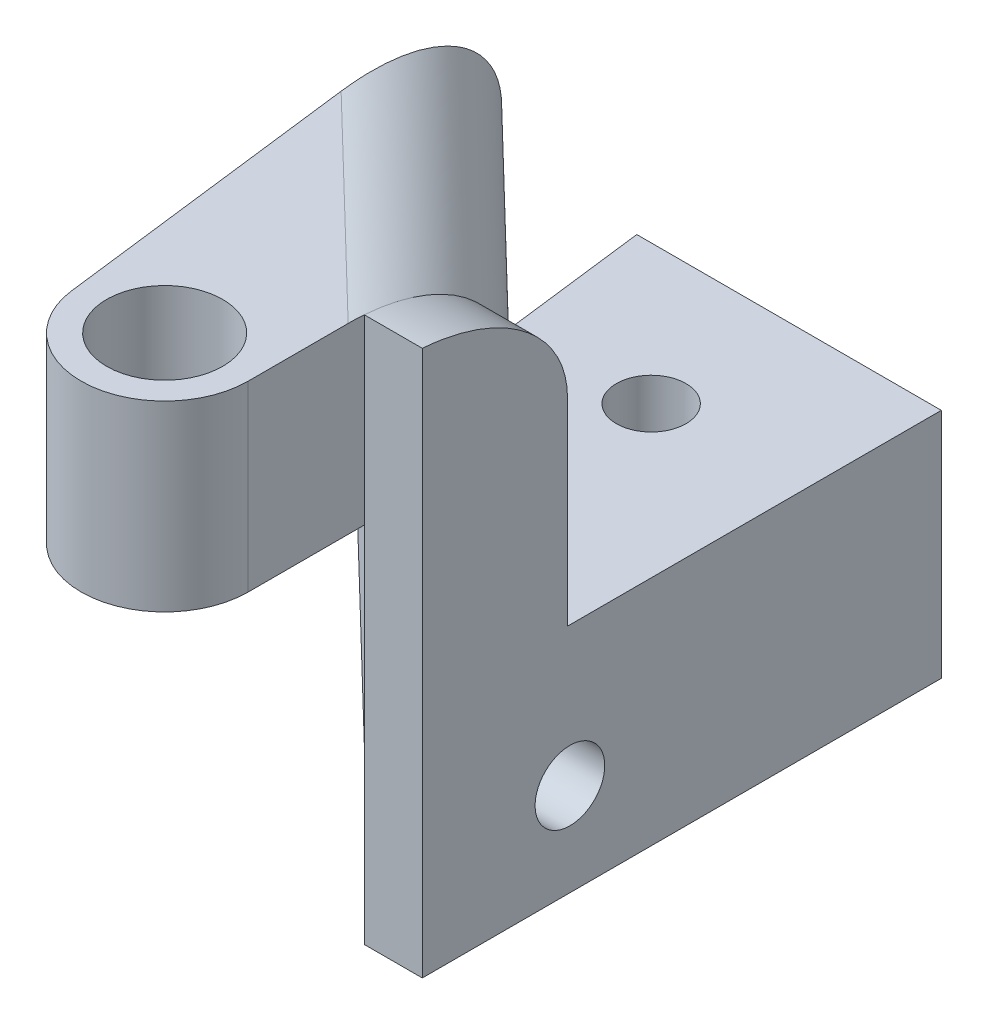
ISO-10303-21;
HEADER;
FILE_DESCRIPTION(('STEP AP214'),'2;1');
FILE_NAME('part.step','',(''),(''),'','','');
FILE_SCHEMA(('AUTOMOTIVE_DESIGN { 1 0 10303 214 1 1 1 1 }'));
ENDSEC;
DATA;
#1=APPLICATION_CONTEXT('core data for automotive mechanical design processes');
#2=APPLICATION_PROTOCOL_DEFINITION('international standard','automotive_design',2000,#1);
#3=PRODUCT_CONTEXT('',#1,'mechanical');
#4=PRODUCT('Part','Part','',(#3));
#5=PRODUCT_RELATED_PRODUCT_CATEGORY('part','',(#4));
#6=PRODUCT_DEFINITION_FORMATION('','',#4);
#7=PRODUCT_DEFINITION_CONTEXT('part definition',#1,'design');
#8=PRODUCT_DEFINITION('design','',#6,#7);
#9=PRODUCT_DEFINITION_SHAPE('','',#8);
#10=(LENGTH_UNIT() NAMED_UNIT(*) SI_UNIT(.MILLI.,.METRE.));
#11=(NAMED_UNIT(*) PLANE_ANGLE_UNIT() SI_UNIT($,.RADIAN.));
#12=(NAMED_UNIT(*) SI_UNIT($,.STERADIAN.) SOLID_ANGLE_UNIT());
#13=UNCERTAINTY_MEASURE_WITH_UNIT(LENGTH_MEASURE(1.E-05),#10,'distance_accuracy_value','');
#14=(GEOMETRIC_REPRESENTATION_CONTEXT(3) GLOBAL_UNCERTAINTY_ASSIGNED_CONTEXT((#13)) GLOBAL_UNIT_ASSIGNED_CONTEXT((#10,
#11,#12)) REPRESENTATION_CONTEXT('',''));
#15=CARTESIAN_POINT('',(0.,0.,0.));
#16=DIRECTION('',(0.,0.,1.));
#17=DIRECTION('',(1.,0.,0.));
#18=AXIS2_PLACEMENT_3D('',#15,#16,#17);
#19=CARTESIAN_POINT('',(3.59999999999999,2.5,0.));
#20=DIRECTION('',(-1.,0.,0.));
#21=DIRECTION('',(0.,0.,1.));
#22=AXIS2_PLACEMENT_3D('',#19,#20,#21);
#23=PLANE('',#22);
#24=DIRECTION('',(0.,-1.,0.));
#25=VECTOR('',#24,1.);
#26=CARTESIAN_POINT('',(3.59999999999999,0.,-5.));
#27=LINE('',#26,#25);
#28=CARTESIAN_POINT('',(3.59999999999999,15.9949371855331,-5.));
#29=VERTEX_POINT('',#28);
#30=CARTESIAN_POINT('',(3.59999999999999,8.15,-5.));
#31=VERTEX_POINT('',#30);
#32=EDGE_CURVE('E57',#29,#31,#27,.T.);
#33=ORIENTED_EDGE('',*,*,#32,.F.);
#34=CARTESIAN_POINT('',(3.59999999999999,11.02,-4.30491820449166));
#35=DIRECTION('',(-1.,0.,0.));
#36=DIRECTION('',(0.,0.,1.));
#37=AXIS2_PLACEMENT_3D('',#34,#35,#36);
#38=ELLIPSE('',#37,6.95081795508336,5.);
#39=CARTESIAN_POINT('',(3.59999999999999,16.02,-4.30491820449166));
#40=VERTEX_POINT('',#39);
#41=EDGE_CURVE('E240',#29,#40,#38,.F.);
#42=ORIENTED_EDGE('',*,*,#41,.T.);
#43=DIRECTION('',(0.,0.,-1.));
#44=VECTOR('',#43,1.);
#45=CARTESIAN_POINT('',(3.59999999999999,16.02,0.));
#46=LINE('',#45,#44);
#47=CARTESIAN_POINT('',(3.59999999999999,16.02,0.));
#48=VERTEX_POINT('',#47);
#49=EDGE_CURVE('E196',#48,#40,#46,.T.);
#50=ORIENTED_EDGE('',*,*,#49,.F.);
#51=DIRECTION('',(0.,-1.,0.));
#52=VECTOR('',#51,1.);
#53=CARTESIAN_POINT('',(3.59999999999999,16.02,0.));
#54=LINE('',#53,#52);
#55=CARTESIAN_POINT('',(3.59999999999999,8.15,0.));
#56=VERTEX_POINT('',#55);
#57=EDGE_CURVE('E177',#48,#56,#54,.T.);
#58=ORIENTED_EDGE('',*,*,#57,.T.);
#59=DIRECTION('',(0.,0.,-1.));
#60=VECTOR('',#59,1.);
#61=CARTESIAN_POINT('',(3.59999999999999,8.15,0.));
#62=LINE('',#61,#60);
#63=EDGE_CURVE('E184',#56,#31,#62,.T.);
#64=ORIENTED_EDGE('',*,*,#63,.T.);
#65=EDGE_LOOP('',(#33,#42,#50,#58,#64));
#66=FACE_BOUND('',#65,.T.);
#67=ADVANCED_FACE('F41',(#66),#23,.F.);
#68=CARTESIAN_POINT('',(4.23565797348321,2.5,-4.38615223039065));
#69=DIRECTION('',(0.694658370458993,0.,-0.719339800338655));
#70=DIRECTION('',(-0.719339800338655,0.,-0.694658370458993));
#71=AXIS2_PLACEMENT_3D('',#68,#69,#70);
#72=PLANE('',#71);
#73=DIRECTION('',(0.719339800338655,0.,0.694658370458993));
#74=VECTOR('',#73,1.);
#75=CARTESIAN_POINT('',(4.23565797348321,8.15,-4.38615223039065));
#76=LINE('',#75,#74);
#77=CARTESIAN_POINT('',(-5.31499406887195,8.15,-13.6091096997812));
#78=VERTEX_POINT('',#77);
#79=EDGE_CURVE('E180',#78,#31,#76,.T.);
#80=ORIENTED_EDGE('',*,*,#79,.F.);
#81=DIRECTION('',(0.,-1.,0.));
#82=VECTOR('',#81,1.);
#83=CARTESIAN_POINT('',(-5.31499406887195,2.5,-13.6091096997812));
#84=LINE('',#83,#82);
#85=CARTESIAN_POINT('',(-5.31499406887195,0.,-13.6091096997812));
#86=VERTEX_POINT('',#85);
#87=EDGE_CURVE('E228',#78,#86,#84,.T.);
#88=ORIENTED_EDGE('',*,*,#87,.T.);
#89=DIRECTION('',(0.719339800338655,0.,0.694658370458993));
#90=VECTOR('',#89,1.);
#91=CARTESIAN_POINT('',(4.23565797348321,0.,-4.38615223039065));
#92=LINE('',#91,#90);
#93=CARTESIAN_POINT('',(3.59999999999999,0.,-5.));
#94=VERTEX_POINT('',#93);
#95=EDGE_CURVE('E218',#86,#94,#92,.T.);
#96=ORIENTED_EDGE('',*,*,#95,.T.);
#97=DIRECTION('',(0.,-1.,0.));
#98=VECTOR('',#97,1.);
#99=CARTESIAN_POINT('',(3.59999999999999,2.5,-5.));
#100=LINE('',#99,#98);
#101=EDGE_CURVE('E211',#31,#94,#100,.T.);
#102=ORIENTED_EDGE('',*,*,#101,.F.);
#103=EDGE_LOOP('',(#80,#88,#96,#102));
#104=FACE_BOUND('',#103,.T.);
#105=ADVANCED_FACE('F316',(#104),#72,.F.);
#106=CARTESIAN_POINT('',(0.,2.5,-27.36));
#107=DIRECTION('',(0.,0.,1.));
#108=DIRECTION('',(1.,0.,0.));
#109=AXIS2_PLACEMENT_3D('',#106,#107,#108);
#110=PLANE('',#109);
#111=DIRECTION('',(-1.,0.,0.));
#112=VECTOR('',#111,1.);
#113=CARTESIAN_POINT('',(0.,0.,-27.36));
#114=LINE('',#113,#112);
#115=CARTESIAN_POINT('',(3.59999999999999,0.,-27.36));
#116=VERTEX_POINT('',#115);
#117=CARTESIAN_POINT('',(-7.02000000000001,0.,-27.36));
#118=VERTEX_POINT('',#117);
#119=EDGE_CURVE('E213',#116,#118,#114,.T.);
#120=ORIENTED_EDGE('',*,*,#119,.T.);
#121=DIRECTION('',(0.,-1.,0.));
#122=VECTOR('',#121,1.);
#123=CARTESIAN_POINT('',(-7.02000000000001,2.5,-27.36));
#124=LINE('',#123,#122);
#125=CARTESIAN_POINT('',(-7.02000000000001,2.5,-27.36));
#126=VERTEX_POINT('',#125);
#127=EDGE_CURVE('E226',#126,#118,#124,.T.);
#128=ORIENTED_EDGE('',*,*,#127,.F.);
#129=DIRECTION('',(-1.,0.,0.));
#130=VECTOR('',#129,1.);
#131=CARTESIAN_POINT('',(0.,2.5,-27.36));
#132=LINE('',#131,#130);
#133=CARTESIAN_POINT('',(6.09999999999999,2.5,-27.36));
#134=VERTEX_POINT('',#133);
#135=EDGE_CURVE('E144',#134,#126,#132,.T.);
#136=ORIENTED_EDGE('',*,*,#135,.F.);
#137=DIRECTION('',(0.,1.,0.));
#138=VECTOR('',#137,1.);
#139=CARTESIAN_POINT('',(6.09999999999999,0.,-27.36));
#140=LINE('',#139,#138);
#141=CARTESIAN_POINT('',(6.09999999999999,-7.5,-27.36));
#142=VERTEX_POINT('',#141);
#143=EDGE_CURVE('E136',#142,#134,#140,.T.);
#144=ORIENTED_EDGE('',*,*,#143,.F.);
#145=DIRECTION('',(-1.,0.,0.));
#146=VECTOR('',#145,1.);
#147=CARTESIAN_POINT('',(6.09999999999999,-7.5,-27.36));
#148=LINE('',#147,#146);
#149=CARTESIAN_POINT('',(3.59999999999999,-7.5,-27.36));
#150=VERTEX_POINT('',#149);
#151=EDGE_CURVE('E142',#142,#150,#148,.T.);
#152=ORIENTED_EDGE('',*,*,#151,.T.);
#153=DIRECTION('',(0.,1.,0.));
#154=VECTOR('',#153,1.);
#155=CARTESIAN_POINT('',(3.59999999999999,0.,-27.36));
#156=LINE('',#155,#154);
#157=EDGE_CURVE('E450',#150,#116,#156,.T.);
#158=ORIENTED_EDGE('',*,*,#157,.T.);
#159=EDGE_LOOP('',(#120,#128,#136,#144,#152,#158));
#160=FACE_BOUND('',#159,.T.);
#161=ADVANCED_FACE('F139',(#160),#110,.F.);
#162=CARTESIAN_POINT('',(-3.57264164799381,2.5,0.442980422840522));
#163=DIRECTION('',(0.992400457776062,0.,-0.123050117455701));
#164=DIRECTION('',(-0.123050117455701,0.,-0.992400457776062));
#165=AXIS2_PLACEMENT_3D('',#162,#163,#164);
#166=PLANE('',#165);
#167=DIRECTION('',(0.123050117455701,0.,0.992400457776062));
#168=VECTOR('',#167,1.);
#169=CARTESIAN_POINT('',(-3.57264164799381,16.02,0.442980422840522));
#170=LINE('',#169,#168);
#171=CARTESIAN_POINT('',(-5.21708586756735,16.02,-12.8194790533114));
#172=VERTEX_POINT('',#171);
#173=CARTESIAN_POINT('',(-3.57264164799381,16.02,0.442980422840522));
#174=VERTEX_POINT('',#173);
#175=EDGE_CURVE('E194',#172,#174,#170,.T.);
#176=ORIENTED_EDGE('',*,*,#175,.F.);
#177=CARTESIAN_POINT('',(-5.21708586756735,11.02,-12.8194790533114));
#178=DIRECTION('',(0.992400457776062,0.,-0.123050117455701));
#179=DIRECTION('',(0.123050117455701,0.,0.992400457776062));
#180=AXIS2_PLACEMENT_3D('',#177,#178,#179);
#181=ELLIPSE('',#180,7.95677430700992,5.);
#182=CARTESIAN_POINT('',(-6.19616788061342,11.02,-20.7157855180089));
#183=VERTEX_POINT('',#182);
#184=EDGE_CURVE('E11',#172,#183,#181,.F.);
#185=ORIENTED_EDGE('',*,*,#184,.T.);
#186=DIRECTION('',(0.,-1.,0.));
#187=VECTOR('',#186,1.);
#188=CARTESIAN_POINT('',(-6.19616788061342,34.5389313836738,-20.7157855180089));
#189=LINE('',#188,#187);
#190=CARTESIAN_POINT('',(-6.19616788061342,2.5,-20.7157855180089));
#191=VERTEX_POINT('',#190);
#192=EDGE_CURVE('E200',#183,#191,#189,.T.);
#193=ORIENTED_EDGE('',*,*,#192,.T.);
#194=DIRECTION('',(0.123050117455701,0.,0.992400457776063));
#195=VECTOR('',#194,1.);
#196=CARTESIAN_POINT('',(-3.57264164799381,2.5,0.442980422840522));
#197=LINE('',#196,#195);
#198=EDGE_CURVE('E203',#126,#191,#197,.T.);
#199=ORIENTED_EDGE('',*,*,#198,.F.);
#200=ORIENTED_EDGE('',*,*,#127,.T.);
#201=DIRECTION('',(0.123050117455701,0.,0.992400457776063));
#202=VECTOR('',#201,1.);
#203=CARTESIAN_POINT('',(-3.57264164799381,0.,0.442980422840522));
#204=LINE('',#203,#202);
#205=EDGE_CURVE('E219',#118,#86,#204,.T.);
#206=ORIENTED_EDGE('',*,*,#205,.T.);
#207=ORIENTED_EDGE('',*,*,#87,.F.);
#208=DIRECTION('',(0.123050117455701,0.,0.992400457776063));
#209=VECTOR('',#208,1.);
#210=CARTESIAN_POINT('',(-3.57264164799381,8.15,0.442980422840522));
#211=LINE('',#210,#209);
#212=CARTESIAN_POINT('',(-3.57264164799381,8.15,0.442980422840522));
#213=VERTEX_POINT('',#212);
#214=EDGE_CURVE('E168',#78,#213,#211,.T.);
#215=ORIENTED_EDGE('',*,*,#214,.T.);
#216=DIRECTION('',(0.,-1.,0.));
#217=VECTOR('',#216,1.);
#218=CARTESIAN_POINT('',(-3.57264164799381,16.02,0.442980422840522));
#219=LINE('',#218,#217);
#220=EDGE_CURVE('E191',#174,#213,#219,.T.);
#221=ORIENTED_EDGE('',*,*,#220,.F.);
#222=EDGE_LOOP('',(#176,#185,#193,#199,#200,#206,#207,#215,#221));
#223=FACE_BOUND('',#222,.T.);
#224=ADVANCED_FACE('F254',(#223),#166,.F.);
#225=CARTESIAN_POINT('',(-0.400000000000008,2.5,-21.36));
#226=DIRECTION('',(0.,-1.,0.));
#227=DIRECTION('',(0.,0.,-1.));
#228=AXIS2_PLACEMENT_3D('',#225,#226,#227);
#229=CYLINDRICAL_SURFACE('',#228,1.5);
#230=CARTESIAN_POINT('',(-0.400000000000008,2.5,-21.36));
#231=DIRECTION('',(0.,1.,0.));
#232=DIRECTION('',(0.,0.,1.));
#233=AXIS2_PLACEMENT_3D('',#230,#231,#232);
#234=CIRCLE('',#233,1.5);
#235=CARTESIAN_POINT('',(-0.400000000000008,2.5,-19.86));
#236=VERTEX_POINT('',#235);
#237=EDGE_CURVE('E206',#236,#236,#234,.T.);
#238=ORIENTED_EDGE('',*,*,#237,.T.);
#239=EDGE_LOOP('',(#238));
#240=FACE_BOUND('',#239,.T.);
#241=CARTESIAN_POINT('',(-0.400000000000008,0.,-21.36));
#242=DIRECTION('',(0.,1.,0.));
#243=DIRECTION('',(0.,0.,1.));
#244=AXIS2_PLACEMENT_3D('',#241,#242,#243);
#245=CIRCLE('',#244,1.5);
#246=CARTESIAN_POINT('',(-0.400000000000008,0.,-19.86));
#247=VERTEX_POINT('',#246);
#248=EDGE_CURVE('E205',#247,#247,#245,.T.);
#249=ORIENTED_EDGE('',*,*,#248,.F.);
#250=EDGE_LOOP('',(#249));
#251=FACE_BOUND('',#250,.T.);
#252=ADVANCED_FACE('F315',(#240,#251),#229,.F.);
#253=CARTESIAN_POINT('',(0.,2.5,0.));
#254=DIRECTION('',(0.,1.,0.));
#255=DIRECTION('',(0.,0.,1.));
#256=AXIS2_PLACEMENT_3D('',#253,#254,#255);
#257=PLANE('',#256);
#258=DIRECTION('',(-0.719339800338655,0.,-0.694658370458993));
#259=VECTOR('',#258,1.);
#260=CARTESIAN_POINT('',(7.36162064054868,2.5,-7.6231813319146));
#261=LINE('',#260,#259);
#262=CARTESIAN_POINT('',(3.59999999999999,2.5,-11.255736159575));
#263=VERTEX_POINT('',#262);
#264=EDGE_CURVE('E233',#263,#191,#261,.T.);
#265=ORIENTED_EDGE('',*,*,#264,.F.);
#266=DIRECTION('',(-1.,0.,0.));
#267=VECTOR('',#266,1.);
#268=CARTESIAN_POINT('',(6.09999999999999,2.5,-11.255736159575));
#269=LINE('',#268,#267);
#270=CARTESIAN_POINT('',(6.09999999999999,2.5,-11.255736159575));
#271=VERTEX_POINT('',#270);
#272=EDGE_CURVE('E161',#271,#263,#269,.T.);
#273=ORIENTED_EDGE('',*,*,#272,.F.);
#274=DIRECTION('',(0.,0.,1.));
#275=VECTOR('',#274,1.);
#276=CARTESIAN_POINT('',(6.09999999999999,2.5,0.));
#277=LINE('',#276,#275);
#278=EDGE_CURVE('E150',#134,#271,#277,.T.);
#279=ORIENTED_EDGE('',*,*,#278,.F.);
#280=ORIENTED_EDGE('',*,*,#135,.T.);
#281=ORIENTED_EDGE('',*,*,#198,.T.);
#282=EDGE_LOOP('',(#265,#273,#279,#280,#281));
#283=FACE_BOUND('',#282,.T.);
#284=ORIENTED_EDGE('',*,*,#237,.F.);
#285=EDGE_LOOP('',(#284));
#286=FACE_BOUND('',#285,.T.);
#287=ADVANCED_FACE('F261',(#283,#286),#257,.T.);
#288=CARTESIAN_POINT('',(0.,0.,0.));
#289=DIRECTION('',(0.,1.,0.));
#290=DIRECTION('',(0.,0.,1.));
#291=AXIS2_PLACEMENT_3D('',#288,#289,#290);
#292=PLANE('',#291);
#293=ORIENTED_EDGE('',*,*,#95,.F.);
#294=ORIENTED_EDGE('',*,*,#205,.F.);
#295=ORIENTED_EDGE('',*,*,#119,.F.);
#296=DIRECTION('',(0.,0.,-1.));
#297=VECTOR('',#296,1.);
#298=CARTESIAN_POINT('',(3.59999999999999,0.,0.));
#299=LINE('',#298,#297);
#300=EDGE_CURVE('E197',#94,#116,#299,.T.);
#301=ORIENTED_EDGE('',*,*,#300,.F.);
#302=EDGE_LOOP('',(#293,#294,#295,#301));
#303=FACE_BOUND('',#302,.T.);
#304=ORIENTED_EDGE('',*,*,#248,.T.);
#305=EDGE_LOOP('',(#304));
#306=FACE_BOUND('',#305,.T.);
#307=ADVANCED_FACE('F310',(#303,#306),#292,.F.);
#308=CARTESIAN_POINT('',(7.36162064054868,34.5389313836738,-7.6231813319146));
#309=DIRECTION('',(0.694658370458993,0.,-0.719339800338655));
#310=DIRECTION('',(-0.719339800338655,0.,-0.694658370458993));
#311=AXIS2_PLACEMENT_3D('',#308,#309,#310);
#312=PLANE('',#311);
#313=ORIENTED_EDGE('',*,*,#192,.F.);
#314=DIRECTION('',(0.719339800338655,0.,0.694658370458993));
#315=VECTOR('',#314,1.);
#316=CARTESIAN_POINT('',(7.36162064054868,11.02,-7.6231813319146));
#317=LINE('',#316,#315);
#318=CARTESIAN_POINT('',(3.59999999999999,11.02,-11.255736159575));
#319=VERTEX_POINT('',#318);
#320=EDGE_CURVE('E234',#183,#319,#317,.T.);
#321=ORIENTED_EDGE('',*,*,#320,.T.);
#322=DIRECTION('',(0.,-1.,0.));
#323=VECTOR('',#322,1.);
#324=CARTESIAN_POINT('',(3.59999999999999,34.5389313836738,-11.255736159575));
#325=LINE('',#324,#323);
#326=EDGE_CURVE('E193',#319,#263,#325,.T.);
#327=ORIENTED_EDGE('',*,*,#326,.T.);
#328=ORIENTED_EDGE('',*,*,#264,.T.);
#329=EDGE_LOOP('',(#313,#321,#327,#328));
#330=FACE_BOUND('',#329,.T.);
#331=ADVANCED_FACE('F260',(#330),#312,.T.);
#332=CARTESIAN_POINT('',(0.,16.02,0.));
#333=DIRECTION('',(0.,1.,0.));
#334=DIRECTION('',(0.,0.,1.));
#335=AXIS2_PLACEMENT_3D('',#332,#333,#334);
#336=PLANE('',#335);
#337=ORIENTED_EDGE('',*,*,#49,.T.);
#338=DIRECTION('',(0.719339800338655,0.,0.694658370458993));
#339=VECTOR('',#338,1.);
#340=CARTESIAN_POINT('',(3.88832878825372,16.02,-4.02648233022132));
#341=LINE('',#340,#339);
#342=EDGE_CURVE('E47',#40,#172,#341,.F.);
#343=ORIENTED_EDGE('',*,*,#342,.T.);
#344=ORIENTED_EDGE('',*,*,#175,.T.);
#345=CARTESIAN_POINT('',(0.,16.02,0.));
#346=DIRECTION('',(0.,1.,0.));
#347=DIRECTION('',(0.,0.,1.));
#348=AXIS2_PLACEMENT_3D('',#345,#346,#347);
#349=CIRCLE('',#348,3.59999999999999);
#350=EDGE_CURVE('E176',#174,#48,#349,.T.);
#351=ORIENTED_EDGE('',*,*,#350,.T.);
#352=EDGE_LOOP('',(#337,#343,#344,#351));
#353=FACE_BOUND('',#352,.T.);
#354=CARTESIAN_POINT('',(0.,16.02,0.));
#355=DIRECTION('',(0.,1.,0.));
#356=DIRECTION('',(0.,0.,1.));
#357=AXIS2_PLACEMENT_3D('',#354,#355,#356);
#358=CIRCLE('',#357,2.5);
#359=CARTESIAN_POINT('',(0.,16.02,2.5));
#360=VERTEX_POINT('',#359);
#361=EDGE_CURVE('E173',#360,#360,#358,.T.);
#362=ORIENTED_EDGE('',*,*,#361,.F.);
#363=EDGE_LOOP('',(#362));
#364=FACE_BOUND('',#363,.T.);
#365=ADVANCED_FACE('F244',(#353,#364),#336,.T.);
#366=CARTESIAN_POINT('',(0.,16.02,0.));
#367=DIRECTION('',(0.,-1.,0.));
#368=DIRECTION('',(0.,0.,-1.));
#369=AXIS2_PLACEMENT_3D('',#366,#367,#368);
#370=CYLINDRICAL_SURFACE('',#369,3.59999999999999);
#371=CARTESIAN_POINT('',(0.,8.15,0.));
#372=DIRECTION('',(0.,1.,0.));
#373=DIRECTION('',(0.,0.,1.));
#374=AXIS2_PLACEMENT_3D('',#371,#372,#373);
#375=CIRCLE('',#374,3.59999999999999);
#376=EDGE_CURVE('E182',#213,#56,#375,.T.);
#377=ORIENTED_EDGE('',*,*,#376,.T.);
#378=ORIENTED_EDGE('',*,*,#57,.F.);
#379=ORIENTED_EDGE('',*,*,#350,.F.);
#380=ORIENTED_EDGE('',*,*,#220,.T.);
#381=EDGE_LOOP('',(#377,#378,#379,#380));
#382=FACE_BOUND('',#381,.T.);
#383=ADVANCED_FACE('F296',(#382),#370,.T.);
#384=CARTESIAN_POINT('',(0.,16.02,0.));
#385=DIRECTION('',(0.,-1.,0.));
#386=DIRECTION('',(0.,0.,-1.));
#387=AXIS2_PLACEMENT_3D('',#384,#385,#386);
#388=CYLINDRICAL_SURFACE('',#387,2.5);
#389=ORIENTED_EDGE('',*,*,#361,.T.);
#390=EDGE_LOOP('',(#389));
#391=FACE_BOUND('',#390,.T.);
#392=CARTESIAN_POINT('',(0.,8.15,0.));
#393=DIRECTION('',(0.,1.,0.));
#394=DIRECTION('',(0.,0.,1.));
#395=AXIS2_PLACEMENT_3D('',#392,#393,#394);
#396=CIRCLE('',#395,2.5);
#397=CARTESIAN_POINT('',(0.,8.15,2.5));
#398=VERTEX_POINT('',#397);
#399=EDGE_CURVE('E162',#398,#398,#396,.T.);
#400=ORIENTED_EDGE('',*,*,#399,.F.);
#401=EDGE_LOOP('',(#400));
#402=FACE_BOUND('',#401,.T.);
#403=ADVANCED_FACE('F298',(#391,#402),#388,.F.);
#404=CARTESIAN_POINT('',(0.,8.15,0.));
#405=DIRECTION('',(0.,1.,0.));
#406=DIRECTION('',(0.,0.,1.));
#407=AXIS2_PLACEMENT_3D('',#404,#405,#406);
#408=PLANE('',#407);
#409=ORIENTED_EDGE('',*,*,#399,.T.);
#410=EDGE_LOOP('',(#409));
#411=FACE_BOUND('',#410,.T.);
#412=ORIENTED_EDGE('',*,*,#214,.F.);
#413=ORIENTED_EDGE('',*,*,#79,.T.);
#414=ORIENTED_EDGE('',*,*,#63,.F.);
#415=ORIENTED_EDGE('',*,*,#376,.F.);
#416=EDGE_LOOP('',(#412,#413,#414,#415));
#417=FACE_BOUND('',#416,.T.);
#418=ADVANCED_FACE('F291',(#411,#417),#408,.F.);
#419=CARTESIAN_POINT('',(3.88832878825372,11.02,-4.02648233022132));
#420=DIRECTION('',(0.719339800338655,0.,0.694658370458993));
#421=DIRECTION('',(0.694658370458993,0.,-0.719339800338655));
#422=AXIS2_PLACEMENT_3D('',#419,#420,#421);
#423=CYLINDRICAL_SURFACE('',#422,5.);
#424=ORIENTED_EDGE('',*,*,#184,.F.);
#425=ORIENTED_EDGE('',*,*,#342,.F.);
#426=ORIENTED_EDGE('',*,*,#41,.F.);
#427=EDGE_CURVE('E238',#319,#29,#38,.F.);
#428=ORIENTED_EDGE('',*,*,#427,.F.);
#429=ORIENTED_EDGE('',*,*,#320,.F.);
#430=EDGE_LOOP('',(#424,#425,#426,#428,#429));
#431=FACE_BOUND('',#430,.T.);
#432=ADVANCED_FACE('F43',(#431),#423,.T.);
#433=CARTESIAN_POINT('',(3.59999999999999,0.,0.));
#434=DIRECTION('',(1.,0.,0.));
#435=DIRECTION('',(0.,0.,-1.));
#436=AXIS2_PLACEMENT_3D('',#433,#434,#435);
#437=PLANE('',#436);
#438=CARTESIAN_POINT('',(3.59999999999999,-3.5,-11.36));
#439=DIRECTION('',(1.,0.,0.));
#440=DIRECTION('',(0.,0.,-1.));
#441=AXIS2_PLACEMENT_3D('',#438,#439,#440);
#442=CIRCLE('',#441,1.5);
#443=CARTESIAN_POINT('',(3.59999999999999,-3.5,-12.86));
#444=VERTEX_POINT('',#443);
#445=EDGE_CURVE('E459',#444,#444,#442,.T.);
#446=ORIENTED_EDGE('',*,*,#445,.T.);
#447=EDGE_LOOP('',(#446));
#448=FACE_BOUND('',#447,.T.);
#449=CARTESIAN_POINT('',(3.59999999999999,-7.5,-5.));
#450=VERTEX_POINT('',#449);
#451=EDGE_CURVE('E444',#94,#450,#27,.T.);
#452=ORIENTED_EDGE('',*,*,#451,.F.);
#453=ORIENTED_EDGE('',*,*,#300,.T.);
#454=ORIENTED_EDGE('',*,*,#157,.F.);
#455=DIRECTION('',(0.,0.,-1.));
#456=VECTOR('',#455,1.);
#457=CARTESIAN_POINT('',(3.59999999999999,-7.5,0.));
#458=LINE('',#457,#456);
#459=EDGE_CURVE('E163',#450,#150,#458,.T.);
#460=ORIENTED_EDGE('',*,*,#459,.F.);
#461=EDGE_LOOP('',(#452,#453,#454,#460));
#462=FACE_BOUND('',#461,.T.);
#463=ADVANCED_FACE('F288',(#448,#462),#437,.F.);
#464=CARTESIAN_POINT('',(6.09999999999999,-7.5,0.));
#465=DIRECTION('',(0.,1.,0.));
#466=DIRECTION('',(0.,0.,1.));
#467=AXIS2_PLACEMENT_3D('',#464,#465,#466);
#468=PLANE('',#467);
#469=ORIENTED_EDGE('',*,*,#459,.T.);
#470=ORIENTED_EDGE('',*,*,#151,.F.);
#471=DIRECTION('',(0.,0.,-1.));
#472=VECTOR('',#471,1.);
#473=CARTESIAN_POINT('',(6.09999999999999,-7.5,0.));
#474=LINE('',#473,#472);
#475=CARTESIAN_POINT('',(6.09999999999999,-7.5,-5.));
#476=VERTEX_POINT('',#475);
#477=EDGE_CURVE('E147',#476,#142,#474,.T.);
#478=ORIENTED_EDGE('',*,*,#477,.F.);
#479=DIRECTION('',(-1.,0.,0.));
#480=VECTOR('',#479,1.);
#481=CARTESIAN_POINT('',(6.09999999999999,-7.5,-5.));
#482=LINE('',#481,#480);
#483=EDGE_CURVE('E451',#476,#450,#482,.T.);
#484=ORIENTED_EDGE('',*,*,#483,.T.);
#485=EDGE_LOOP('',(#469,#470,#478,#484));
#486=FACE_BOUND('',#485,.T.);
#487=ADVANCED_FACE('F158',(#486),#468,.F.);
#488=CARTESIAN_POINT('',(6.09999999999999,0.,-11.255736159575));
#489=DIRECTION('',(0.,0.,1.));
#490=DIRECTION('',(1.,0.,0.));
#491=AXIS2_PLACEMENT_3D('',#488,#489,#490);
#492=PLANE('',#491);
#493=ORIENTED_EDGE('',*,*,#326,.F.);
#494=DIRECTION('',(-1.,0.,0.));
#495=VECTOR('',#494,1.);
#496=CARTESIAN_POINT('',(6.09999999999999,11.02,-11.255736159575));
#497=LINE('',#496,#495);
#498=CARTESIAN_POINT('',(6.09999999999999,11.02,-11.255736159575));
#499=VERTEX_POINT('',#498);
#500=EDGE_CURVE('E169',#499,#319,#497,.T.);
#501=ORIENTED_EDGE('',*,*,#500,.F.);
#502=DIRECTION('',(0.,1.,0.));
#503=VECTOR('',#502,1.);
#504=CARTESIAN_POINT('',(6.09999999999999,0.,-11.255736159575));
#505=LINE('',#504,#503);
#506=EDGE_CURVE('E269',#271,#499,#505,.T.);
#507=ORIENTED_EDGE('',*,*,#506,.F.);
#508=ORIENTED_EDGE('',*,*,#272,.T.);
#509=EDGE_LOOP('',(#493,#501,#507,#508));
#510=FACE_BOUND('',#509,.T.);
#511=ADVANCED_FACE('F266',(#510),#492,.F.);
#512=CARTESIAN_POINT('',(6.09999999999999,11.02,-4.30491820449166));
#513=DIRECTION('',(1.,0.,0.));
#514=DIRECTION('',(0.,0.,1.));
#515=AXIS2_PLACEMENT_3D('',#512,#513,#514);
#516=ELLIPSE('',#515,6.95081795508336,5.);
#517=DIRECTION('',(-1.,0.,0.));
#518=VECTOR('',#517,1.);
#519=SURFACE_OF_LINEAR_EXTRUSION('',#516,#518);
#520=ORIENTED_EDGE('',*,*,#427,.T.);
#521=DIRECTION('',(-1.,0.,0.));
#522=VECTOR('',#521,1.);
#523=CARTESIAN_POINT('',(6.09999999999999,15.9949371855331,-5.));
#524=LINE('',#523,#522);
#525=CARTESIAN_POINT('',(6.09999999999999,15.9949371855331,-5.));
#526=VERTEX_POINT('',#525);
#527=EDGE_CURVE('E452',#526,#29,#524,.T.);
#528=ORIENTED_EDGE('',*,*,#527,.F.);
#529=EDGE_CURVE('E270',#499,#526,#516,.T.);
#530=ORIENTED_EDGE('',*,*,#529,.F.);
#531=ORIENTED_EDGE('',*,*,#500,.T.);
#532=EDGE_LOOP('',(#520,#528,#530,#531));
#533=FACE_BOUND('',#532,.T.);
#534=ADVANCED_FACE('F277',(#533),#519,.F.);
#535=CARTESIAN_POINT('',(6.09999999999999,-3.5,-11.36));
#536=DIRECTION('',(-1.,0.,0.));
#537=DIRECTION('',(0.,0.,1.));
#538=AXIS2_PLACEMENT_3D('',#535,#536,#537);
#539=CYLINDRICAL_SURFACE('',#538,1.5);
#540=CARTESIAN_POINT('',(6.09999999999999,-3.5,-11.36));
#541=DIRECTION('',(1.,0.,0.));
#542=DIRECTION('',(0.,0.,-1.));
#543=AXIS2_PLACEMENT_3D('',#540,#541,#542);
#544=CIRCLE('',#543,1.5);
#545=CARTESIAN_POINT('',(6.09999999999999,-3.5,-12.86));
#546=VERTEX_POINT('',#545);
#547=EDGE_CURVE('E157',#546,#546,#544,.T.);
#548=ORIENTED_EDGE('',*,*,#547,.T.);
#549=EDGE_LOOP('',(#548));
#550=FACE_BOUND('',#549,.T.);
#551=ORIENTED_EDGE('',*,*,#445,.F.);
#552=EDGE_LOOP('',(#551));
#553=FACE_BOUND('',#552,.T.);
#554=ADVANCED_FACE('F281',(#550,#553),#539,.F.);
#555=CARTESIAN_POINT('',(6.09999999999999,0.,-5.));
#556=DIRECTION('',(0.,0.,-1.));
#557=DIRECTION('',(0.,1.,0.));
#558=AXIS2_PLACEMENT_3D('',#555,#556,#557);
#559=PLANE('',#558);
#560=ORIENTED_EDGE('',*,*,#32,.T.);
#561=ORIENTED_EDGE('',*,*,#101,.T.);
#562=ORIENTED_EDGE('',*,*,#451,.T.);
#563=ORIENTED_EDGE('',*,*,#483,.F.);
#564=DIRECTION('',(0.,-1.,0.));
#565=VECTOR('',#564,1.);
#566=CARTESIAN_POINT('',(6.09999999999999,0.,-5.));
#567=LINE('',#566,#565);
#568=EDGE_CURVE('E155',#526,#476,#567,.T.);
#569=ORIENTED_EDGE('',*,*,#568,.F.);
#570=ORIENTED_EDGE('',*,*,#527,.T.);
#571=EDGE_LOOP('',(#560,#561,#562,#563,#569,#570));
#572=FACE_BOUND('',#571,.T.);
#573=ADVANCED_FACE('F285',(#572),#559,.F.);
#574=CARTESIAN_POINT('',(6.09999999999999,0.,0.));
#575=DIRECTION('',(1.,0.,0.));
#576=DIRECTION('',(0.,0.,-1.));
#577=AXIS2_PLACEMENT_3D('',#574,#575,#576);
#578=PLANE('',#577);
#579=ORIENTED_EDGE('',*,*,#547,.F.);
#580=EDGE_LOOP('',(#579));
#581=FACE_BOUND('',#580,.T.);
#582=ORIENTED_EDGE('',*,*,#477,.T.);
#583=ORIENTED_EDGE('',*,*,#143,.T.);
#584=ORIENTED_EDGE('',*,*,#278,.T.);
#585=ORIENTED_EDGE('',*,*,#506,.T.);
#586=ORIENTED_EDGE('',*,*,#529,.T.);
#587=ORIENTED_EDGE('',*,*,#568,.T.);
#588=EDGE_LOOP('',(#582,#583,#584,#585,#586,#587));
#589=FACE_BOUND('',#588,.T.);
#590=ADVANCED_FACE('F154',(#581,#589),#578,.T.);
#591=CLOSED_SHELL('',(#67,#105,#161,#224,#252,#287,#307,#331,#365,#383,#403,#418,#432,#463,#487,
#511,#534,#554,#573,#590));
#592=MANIFOLD_SOLID_BREP('B2',#591);
#593=ADVANCED_BREP_SHAPE_REPRESENTATION('',(#18,#592),#14);
#594=SHAPE_DEFINITION_REPRESENTATION(#9,#593);
ENDSEC;
END-ISO-10303-21;
